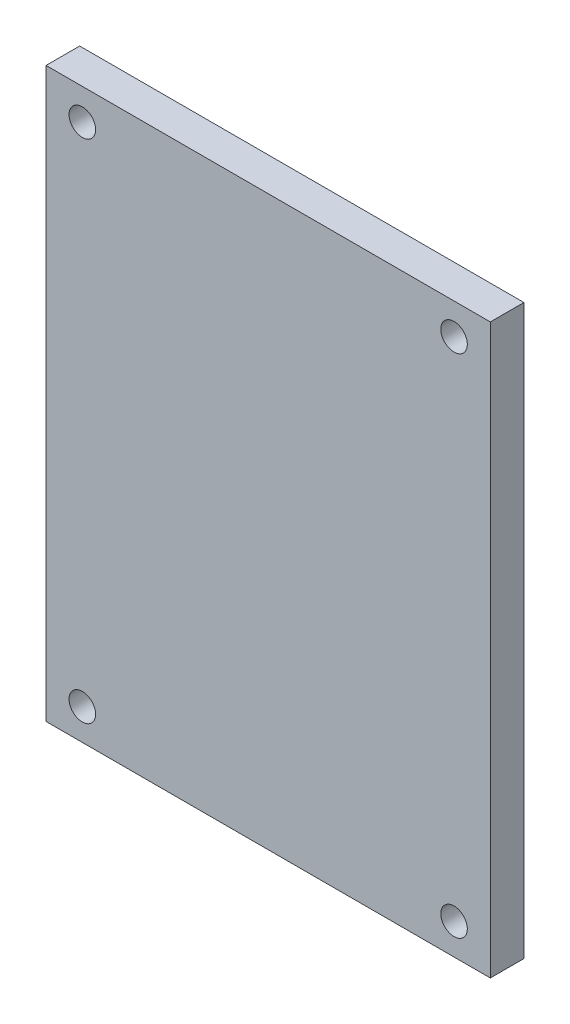
ISO-10303-21;
HEADER;
FILE_DESCRIPTION(('STEP AP214'),'2;1');
FILE_NAME('part.step','',(''),(''),'','','');
FILE_SCHEMA(('AUTOMOTIVE_DESIGN { 1 0 10303 214 1 1 1 1 }'));
ENDSEC;
DATA;
#1=APPLICATION_CONTEXT('core data for automotive mechanical design processes');
#2=APPLICATION_PROTOCOL_DEFINITION('international standard','automotive_design',2000,#1);
#3=PRODUCT_CONTEXT('',#1,'mechanical');
#4=PRODUCT('Part','Part','',(#3));
#5=PRODUCT_RELATED_PRODUCT_CATEGORY('part','',(#4));
#6=PRODUCT_DEFINITION_FORMATION('','',#4);
#7=PRODUCT_DEFINITION_CONTEXT('part definition',#1,'design');
#8=PRODUCT_DEFINITION('design','',#6,#7);
#9=PRODUCT_DEFINITION_SHAPE('','',#8);
#10=(LENGTH_UNIT() NAMED_UNIT(*) SI_UNIT(.MILLI.,.METRE.));
#11=(NAMED_UNIT(*) PLANE_ANGLE_UNIT() SI_UNIT($,.RADIAN.));
#12=(NAMED_UNIT(*) SI_UNIT($,.STERADIAN.) SOLID_ANGLE_UNIT());
#13=UNCERTAINTY_MEASURE_WITH_UNIT(LENGTH_MEASURE(1.E-05),#10,'distance_accuracy_value','');
#14=(GEOMETRIC_REPRESENTATION_CONTEXT(3) GLOBAL_UNCERTAINTY_ASSIGNED_CONTEXT((#13)) GLOBAL_UNIT_ASSIGNED_CONTEXT((#10,
#11,#12)) REPRESENTATION_CONTEXT('',''));
#15=CARTESIAN_POINT('',(0.,0.,0.));
#16=DIRECTION('',(0.,0.,1.));
#17=DIRECTION('',(1.,0.,0.));
#18=AXIS2_PLACEMENT_3D('',#15,#16,#17);
#19=CARTESIAN_POINT('',(0.,0.,4.826));
#20=DIRECTION('',(0.,0.,-1.));
#21=DIRECTION('',(-1.,0.,0.));
#22=AXIS2_PLACEMENT_3D('',#19,#20,#21);
#23=PLANE('',#22);
#24=DIRECTION('',(0.,-1.,0.));
#25=VECTOR('',#24,1.);
#26=CARTESIAN_POINT('',(0.,0.,4.826));
#27=LINE('',#26,#25);
#28=CARTESIAN_POINT('',(0.,81.534,4.826));
#29=VERTEX_POINT('',#28);
#30=CARTESIAN_POINT('',(0.,0.,4.826));
#31=VERTEX_POINT('',#30);
#32=EDGE_CURVE('E85',#29,#31,#27,.T.);
#33=ORIENTED_EDGE('',*,*,#32,.T.);
#34=DIRECTION('',(1.,0.,0.));
#35=VECTOR('',#34,1.);
#36=CARTESIAN_POINT('',(0.,0.,4.826));
#37=LINE('',#36,#35);
#38=CARTESIAN_POINT('',(63.754,0.,4.826));
#39=VERTEX_POINT('',#38);
#40=EDGE_CURVE('E80',#31,#39,#37,.T.);
#41=ORIENTED_EDGE('',*,*,#40,.T.);
#42=DIRECTION('',(0.,1.,0.));
#43=VECTOR('',#42,1.);
#44=CARTESIAN_POINT('',(63.754,0.,4.826));
#45=LINE('',#44,#43);
#46=CARTESIAN_POINT('',(63.754,81.534,4.826));
#47=VERTEX_POINT('',#46);
#48=EDGE_CURVE('E83',#39,#47,#45,.T.);
#49=ORIENTED_EDGE('',*,*,#48,.T.);
#50=DIRECTION('',(-1.,0.,0.));
#51=VECTOR('',#50,1.);
#52=CARTESIAN_POINT('',(0.,81.534,4.826));
#53=LINE('',#52,#51);
#54=EDGE_CURVE('E50',#47,#29,#53,.T.);
#55=ORIENTED_EDGE('',*,*,#54,.T.);
#56=EDGE_LOOP('',(#33,#41,#49,#55));
#57=FACE_BOUND('',#56,.T.);
#58=CARTESIAN_POINT('',(5.207,77.089,4.826));
#59=DIRECTION('',(0.,0.,1.));
#60=DIRECTION('',(1.,0.,0.));
#61=AXIS2_PLACEMENT_3D('',#58,#59,#60);
#62=CIRCLE('',#61,1.90500000000001);
#63=CARTESIAN_POINT('',(7.11200000000001,77.089,4.826));
#64=VERTEX_POINT('',#63);
#65=EDGE_CURVE('E100',#64,#64,#62,.T.);
#66=ORIENTED_EDGE('',*,*,#65,.F.);
#67=EDGE_LOOP('',(#66));
#68=FACE_BOUND('',#67,.T.);
#69=CARTESIAN_POINT('',(58.547,77.089,4.826));
#70=DIRECTION('',(0.,0.,1.));
#71=DIRECTION('',(1.,0.,0.));
#72=AXIS2_PLACEMENT_3D('',#69,#70,#71);
#73=CIRCLE('',#72,1.905);
#74=CARTESIAN_POINT('',(60.452,77.089,4.826));
#75=VERTEX_POINT('',#74);
#76=EDGE_CURVE('E115',#75,#75,#73,.T.);
#77=ORIENTED_EDGE('',*,*,#76,.F.);
#78=EDGE_LOOP('',(#77));
#79=FACE_BOUND('',#78,.T.);
#80=CARTESIAN_POINT('',(5.207,4.44500000000001,4.826));
#81=DIRECTION('',(0.,0.,1.));
#82=DIRECTION('',(1.,0.,0.));
#83=AXIS2_PLACEMENT_3D('',#80,#81,#82);
#84=CIRCLE('',#83,1.905);
#85=CARTESIAN_POINT('',(7.112,4.44500000000001,4.826));
#86=VERTEX_POINT('',#85);
#87=EDGE_CURVE('E121',#86,#86,#84,.T.);
#88=ORIENTED_EDGE('',*,*,#87,.F.);
#89=EDGE_LOOP('',(#88));
#90=FACE_BOUND('',#89,.T.);
#91=CARTESIAN_POINT('',(58.547,4.44500000000004,4.826));
#92=DIRECTION('',(0.,0.,1.));
#93=DIRECTION('',(1.,0.,0.));
#94=AXIS2_PLACEMENT_3D('',#91,#92,#93);
#95=CIRCLE('',#94,1.905);
#96=CARTESIAN_POINT('',(60.452,4.44500000000004,4.826));
#97=VERTEX_POINT('',#96);
#98=EDGE_CURVE('E127',#97,#97,#95,.T.);
#99=ORIENTED_EDGE('',*,*,#98,.F.);
#100=EDGE_LOOP('',(#99));
#101=FACE_BOUND('',#100,.T.);
#102=ADVANCED_FACE('F33',(#57,#68,#79,#90,#101),#23,.F.);
#103=CARTESIAN_POINT('',(0.,0.,0.));
#104=DIRECTION('',(0.,0.,-1.));
#105=DIRECTION('',(-1.,0.,0.));
#106=AXIS2_PLACEMENT_3D('',#103,#104,#105);
#107=PLANE('',#106);
#108=CARTESIAN_POINT('',(5.207,4.44500000000001,0.));
#109=DIRECTION('',(0.,0.,1.));
#110=DIRECTION('',(1.,0.,0.));
#111=AXIS2_PLACEMENT_3D('',#108,#109,#110);
#112=CIRCLE('',#111,1.905);
#113=CARTESIAN_POINT('',(7.112,4.44500000000001,0.));
#114=VERTEX_POINT('',#113);
#115=EDGE_CURVE('E124',#114,#114,#112,.T.);
#116=ORIENTED_EDGE('',*,*,#115,.T.);
#117=EDGE_LOOP('',(#116));
#118=FACE_BOUND('',#117,.T.);
#119=CARTESIAN_POINT('',(5.207,77.089,0.));
#120=DIRECTION('',(0.,0.,1.));
#121=DIRECTION('',(1.,0.,0.));
#122=AXIS2_PLACEMENT_3D('',#119,#120,#121);
#123=CIRCLE('',#122,1.90500000000001);
#124=CARTESIAN_POINT('',(7.11200000000001,77.089,0.));
#125=VERTEX_POINT('',#124);
#126=EDGE_CURVE('E112',#125,#125,#123,.T.);
#127=ORIENTED_EDGE('',*,*,#126,.T.);
#128=EDGE_LOOP('',(#127));
#129=FACE_BOUND('',#128,.T.);
#130=DIRECTION('',(0.,-1.,0.));
#131=VECTOR('',#130,1.);
#132=CARTESIAN_POINT('',(0.,0.,0.));
#133=LINE('',#132,#131);
#134=CARTESIAN_POINT('',(0.,81.534,0.));
#135=VERTEX_POINT('',#134);
#136=CARTESIAN_POINT('',(0.,0.,0.));
#137=VERTEX_POINT('',#136);
#138=EDGE_CURVE('E97',#135,#137,#133,.T.);
#139=ORIENTED_EDGE('',*,*,#138,.F.);
#140=DIRECTION('',(-1.,0.,0.));
#141=VECTOR('',#140,1.);
#142=CARTESIAN_POINT('',(0.,81.534,0.));
#143=LINE('',#142,#141);
#144=CARTESIAN_POINT('',(63.754,81.534,0.));
#145=VERTEX_POINT('',#144);
#146=EDGE_CURVE('E73',#145,#135,#143,.T.);
#147=ORIENTED_EDGE('',*,*,#146,.F.);
#148=DIRECTION('',(0.,1.,0.));
#149=VECTOR('',#148,1.);
#150=CARTESIAN_POINT('',(63.754,0.,0.));
#151=LINE('',#150,#149);
#152=CARTESIAN_POINT('',(63.754,0.,0.));
#153=VERTEX_POINT('',#152);
#154=EDGE_CURVE('E67',#153,#145,#151,.T.);
#155=ORIENTED_EDGE('',*,*,#154,.F.);
#156=DIRECTION('',(1.,0.,0.));
#157=VECTOR('',#156,1.);
#158=CARTESIAN_POINT('',(0.,0.,0.));
#159=LINE('',#158,#157);
#160=EDGE_CURVE('E89',#137,#153,#159,.T.);
#161=ORIENTED_EDGE('',*,*,#160,.F.);
#162=EDGE_LOOP('',(#139,#147,#155,#161));
#163=FACE_BOUND('',#162,.T.);
#164=CARTESIAN_POINT('',(58.547,77.089,0.));
#165=DIRECTION('',(0.,0.,1.));
#166=DIRECTION('',(1.,0.,0.));
#167=AXIS2_PLACEMENT_3D('',#164,#165,#166);
#168=CIRCLE('',#167,1.905);
#169=CARTESIAN_POINT('',(60.452,77.089,0.));
#170=VERTEX_POINT('',#169);
#171=EDGE_CURVE('E118',#170,#170,#168,.T.);
#172=ORIENTED_EDGE('',*,*,#171,.T.);
#173=EDGE_LOOP('',(#172));
#174=FACE_BOUND('',#173,.T.);
#175=CARTESIAN_POINT('',(58.547,4.44500000000004,0.));
#176=DIRECTION('',(0.,0.,1.));
#177=DIRECTION('',(1.,0.,0.));
#178=AXIS2_PLACEMENT_3D('',#175,#176,#177);
#179=CIRCLE('',#178,1.905);
#180=CARTESIAN_POINT('',(60.452,4.44500000000004,0.));
#181=VERTEX_POINT('',#180);
#182=EDGE_CURVE('E130',#181,#181,#179,.T.);
#183=ORIENTED_EDGE('',*,*,#182,.T.);
#184=EDGE_LOOP('',(#183));
#185=FACE_BOUND('',#184,.T.);
#186=ADVANCED_FACE('F108',(#118,#129,#163,#174,#185),#107,.T.);
#187=CARTESIAN_POINT('',(0.,0.,4.826));
#188=DIRECTION('',(1.,0.,0.));
#189=DIRECTION('',(0.,0.,-1.));
#190=AXIS2_PLACEMENT_3D('',#187,#188,#189);
#191=PLANE('',#190);
#192=ORIENTED_EDGE('',*,*,#138,.T.);
#193=DIRECTION('',(0.,0.,-1.));
#194=VECTOR('',#193,1.);
#195=CARTESIAN_POINT('',(0.,0.,4.826));
#196=LINE('',#195,#194);
#197=EDGE_CURVE('E11',#31,#137,#196,.T.);
#198=ORIENTED_EDGE('',*,*,#197,.F.);
#199=ORIENTED_EDGE('',*,*,#32,.F.);
#200=DIRECTION('',(0.,0.,-1.));
#201=VECTOR('',#200,1.);
#202=CARTESIAN_POINT('',(0.,81.534,4.826));
#203=LINE('',#202,#201);
#204=EDGE_CURVE('E93',#29,#135,#203,.T.);
#205=ORIENTED_EDGE('',*,*,#204,.T.);
#206=EDGE_LOOP('',(#192,#198,#199,#205));
#207=FACE_BOUND('',#206,.T.);
#208=ADVANCED_FACE('F35',(#207),#191,.F.);
#209=CARTESIAN_POINT('',(0.,0.,4.826));
#210=DIRECTION('',(0.,1.,0.));
#211=DIRECTION('',(0.,0.,1.));
#212=AXIS2_PLACEMENT_3D('',#209,#210,#211);
#213=PLANE('',#212);
#214=ORIENTED_EDGE('',*,*,#160,.T.);
#215=DIRECTION('',(0.,0.,-1.));
#216=VECTOR('',#215,1.);
#217=CARTESIAN_POINT('',(63.754,0.,4.826));
#218=LINE('',#217,#216);
#219=EDGE_CURVE('E42',#39,#153,#218,.T.);
#220=ORIENTED_EDGE('',*,*,#219,.F.);
#221=ORIENTED_EDGE('',*,*,#40,.F.);
#222=ORIENTED_EDGE('',*,*,#197,.T.);
#223=EDGE_LOOP('',(#214,#220,#221,#222));
#224=FACE_BOUND('',#223,.T.);
#225=ADVANCED_FACE('F88',(#224),#213,.F.);
#226=CARTESIAN_POINT('',(63.754,0.,4.826));
#227=DIRECTION('',(-1.,0.,0.));
#228=DIRECTION('',(0.,-1.,0.));
#229=AXIS2_PLACEMENT_3D('',#226,#227,#228);
#230=PLANE('',#229);
#231=ORIENTED_EDGE('',*,*,#154,.T.);
#232=DIRECTION('',(0.,0.,-1.));
#233=VECTOR('',#232,1.);
#234=CARTESIAN_POINT('',(63.754,81.534,4.826));
#235=LINE('',#234,#233);
#236=EDGE_CURVE('E90',#47,#145,#235,.T.);
#237=ORIENTED_EDGE('',*,*,#236,.F.);
#238=ORIENTED_EDGE('',*,*,#48,.F.);
#239=ORIENTED_EDGE('',*,*,#219,.T.);
#240=EDGE_LOOP('',(#231,#237,#238,#239));
#241=FACE_BOUND('',#240,.T.);
#242=ADVANCED_FACE('F91',(#241),#230,.F.);
#243=CARTESIAN_POINT('',(0.,81.534,4.826));
#244=DIRECTION('',(0.,-1.,0.));
#245=DIRECTION('',(0.,0.,-1.));
#246=AXIS2_PLACEMENT_3D('',#243,#244,#245);
#247=PLANE('',#246);
#248=ORIENTED_EDGE('',*,*,#146,.T.);
#249=ORIENTED_EDGE('',*,*,#204,.F.);
#250=ORIENTED_EDGE('',*,*,#54,.F.);
#251=ORIENTED_EDGE('',*,*,#236,.T.);
#252=EDGE_LOOP('',(#248,#249,#250,#251));
#253=FACE_BOUND('',#252,.T.);
#254=ADVANCED_FACE('F105',(#253),#247,.F.);
#255=CARTESIAN_POINT('',(5.207,77.089,4.826));
#256=DIRECTION('',(0.,0.,-1.));
#257=DIRECTION('',(-1.,0.,0.));
#258=AXIS2_PLACEMENT_3D('',#255,#256,#257);
#259=CYLINDRICAL_SURFACE('',#258,1.90500000000001);
#260=ORIENTED_EDGE('',*,*,#65,.T.);
#261=EDGE_LOOP('',(#260));
#262=FACE_BOUND('',#261,.T.);
#263=ORIENTED_EDGE('',*,*,#126,.F.);
#264=EDGE_LOOP('',(#263));
#265=FACE_BOUND('',#264,.T.);
#266=ADVANCED_FACE('F147',(#262,#265),#259,.F.);
#267=CARTESIAN_POINT('',(58.547,77.089,4.826));
#268=DIRECTION('',(0.,0.,-1.));
#269=DIRECTION('',(-1.,0.,0.));
#270=AXIS2_PLACEMENT_3D('',#267,#268,#269);
#271=CYLINDRICAL_SURFACE('',#270,1.905);
#272=ORIENTED_EDGE('',*,*,#76,.T.);
#273=EDGE_LOOP('',(#272));
#274=FACE_BOUND('',#273,.T.);
#275=ORIENTED_EDGE('',*,*,#171,.F.);
#276=EDGE_LOOP('',(#275));
#277=FACE_BOUND('',#276,.T.);
#278=ADVANCED_FACE('F193',(#274,#277),#271,.F.);
#279=CARTESIAN_POINT('',(5.207,4.44500000000001,4.826));
#280=DIRECTION('',(0.,0.,-1.));
#281=DIRECTION('',(-1.,0.,0.));
#282=AXIS2_PLACEMENT_3D('',#279,#280,#281);
#283=CYLINDRICAL_SURFACE('',#282,1.905);
#284=ORIENTED_EDGE('',*,*,#87,.T.);
#285=EDGE_LOOP('',(#284));
#286=FACE_BOUND('',#285,.T.);
#287=ORIENTED_EDGE('',*,*,#115,.F.);
#288=EDGE_LOOP('',(#287));
#289=FACE_BOUND('',#288,.T.);
#290=ADVANCED_FACE('F201',(#286,#289),#283,.F.);
#291=CARTESIAN_POINT('',(58.547,4.44500000000004,4.826));
#292=DIRECTION('',(0.,0.,-1.));
#293=DIRECTION('',(-1.,0.,0.));
#294=AXIS2_PLACEMENT_3D('',#291,#292,#293);
#295=CYLINDRICAL_SURFACE('',#294,1.905);
#296=ORIENTED_EDGE('',*,*,#98,.T.);
#297=EDGE_LOOP('',(#296));
#298=FACE_BOUND('',#297,.T.);
#299=ORIENTED_EDGE('',*,*,#182,.F.);
#300=EDGE_LOOP('',(#299));
#301=FACE_BOUND('',#300,.T.);
#302=ADVANCED_FACE('F136',(#298,#301),#295,.F.);
#303=CLOSED_SHELL('',(#102,#186,#208,#225,#242,#254,#266,#278,#290,#302));
#304=MANIFOLD_SOLID_BREP('B2',#303);
#305=ADVANCED_BREP_SHAPE_REPRESENTATION('',(#18,#304),#14);
#306=SHAPE_DEFINITION_REPRESENTATION(#9,#305);
ENDSEC;
END-ISO-10303-21;
